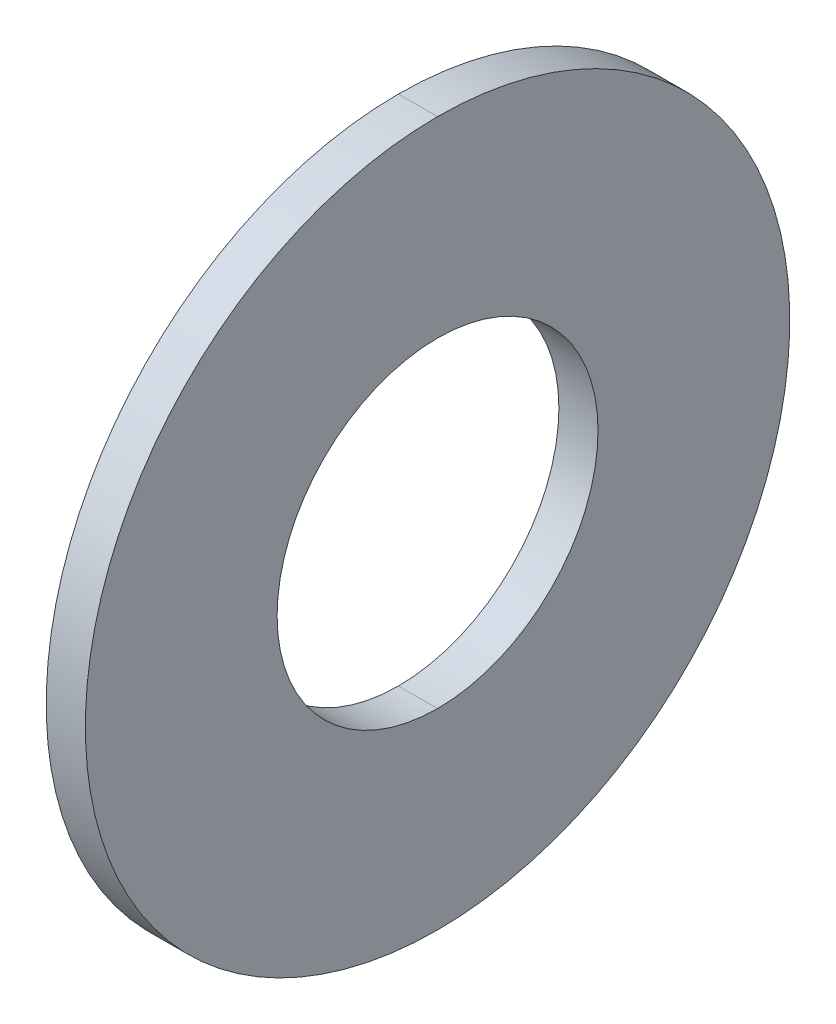
ISO-10303-21;
HEADER;
FILE_DESCRIPTION(('STEP AP214'),'2;1');
FILE_NAME('part.step','',(''),(''),'','','');
FILE_SCHEMA(('AUTOMOTIVE_DESIGN { 1 0 10303 214 1 1 1 1 }'));
ENDSEC;
DATA;
#1=APPLICATION_CONTEXT('core data for automotive mechanical design processes');
#2=APPLICATION_PROTOCOL_DEFINITION('international standard','automotive_design',2000,#1);
#3=PRODUCT_CONTEXT('',#1,'mechanical');
#4=PRODUCT('Part','Part','',(#3));
#5=PRODUCT_RELATED_PRODUCT_CATEGORY('part','',(#4));
#6=PRODUCT_DEFINITION_FORMATION('','',#4);
#7=PRODUCT_DEFINITION_CONTEXT('part definition',#1,'design');
#8=PRODUCT_DEFINITION('design','',#6,#7);
#9=PRODUCT_DEFINITION_SHAPE('','',#8);
#10=(LENGTH_UNIT() NAMED_UNIT(*) SI_UNIT(.MILLI.,.METRE.));
#11=(NAMED_UNIT(*) PLANE_ANGLE_UNIT() SI_UNIT($,.RADIAN.));
#12=(NAMED_UNIT(*) SI_UNIT($,.STERADIAN.) SOLID_ANGLE_UNIT());
#13=UNCERTAINTY_MEASURE_WITH_UNIT(LENGTH_MEASURE(1.E-05),#10,'distance_accuracy_value','');
#14=(GEOMETRIC_REPRESENTATION_CONTEXT(3) GLOBAL_UNCERTAINTY_ASSIGNED_CONTEXT((#13)) GLOBAL_UNIT_ASSIGNED_CONTEXT((#10,
#11,#12)) REPRESENTATION_CONTEXT('',''));
#15=CARTESIAN_POINT('',(0.,0.,0.));
#16=DIRECTION('',(0.,0.,1.));
#17=DIRECTION('',(1.,0.,0.));
#18=AXIS2_PLACEMENT_3D('',#15,#16,#17);
#19=CARTESIAN_POINT('',(0.,0.,0.));
#20=DIRECTION('',(1.,0.,0.));
#21=DIRECTION('',(0.,-1.,0.));
#22=AXIS2_PLACEMENT_3D('',#19,#20,#21);
#23=PLANE('',#22);
#24=CARTESIAN_POINT('',(0.,0.,0.));
#25=DIRECTION('',(1.,0.,0.));
#26=DIRECTION('',(0.,1.,0.));
#27=AXIS2_PLACEMENT_3D('',#24,#25,#26);
#28=CIRCLE('',#27,4.5);
#29=CARTESIAN_POINT('',(0.,4.5,0.));
#30=VERTEX_POINT('',#29);
#31=CARTESIAN_POINT('',(0.,-4.5,0.));
#32=VERTEX_POINT('',#31);
#33=EDGE_CURVE('E27',#30,#32,#28,.T.);
#34=ORIENTED_EDGE('',*,*,#33,.F.);
#35=CARTESIAN_POINT('',(0.,0.,0.));
#36=DIRECTION('',(1.,0.,0.));
#37=DIRECTION('',(0.,-1.,0.));
#38=AXIS2_PLACEMENT_3D('',#35,#36,#37);
#39=CIRCLE('',#38,4.5);
#40=EDGE_CURVE('E36',#32,#30,#39,.T.);
#41=ORIENTED_EDGE('',*,*,#40,.F.);
#42=EDGE_LOOP('',(#34,#41));
#43=FACE_BOUND('',#42,.T.);
#44=CARTESIAN_POINT('',(0.,0.,0.));
#45=DIRECTION('',(-1.,0.,0.));
#46=DIRECTION('',(0.,1.,0.));
#47=AXIS2_PLACEMENT_3D('',#44,#45,#46);
#48=CIRCLE('',#47,2.05);
#49=CARTESIAN_POINT('',(0.,2.05,0.));
#50=VERTEX_POINT('',#49);
#51=CARTESIAN_POINT('',(0.,-2.05,0.));
#52=VERTEX_POINT('',#51);
#53=EDGE_CURVE('E55',#50,#52,#48,.T.);
#54=ORIENTED_EDGE('',*,*,#53,.F.);
#55=CARTESIAN_POINT('',(0.,0.,0.));
#56=DIRECTION('',(-1.,0.,0.));
#57=DIRECTION('',(0.,-1.,0.));
#58=AXIS2_PLACEMENT_3D('',#55,#56,#57);
#59=CIRCLE('',#58,2.05);
#60=EDGE_CURVE('E20',#52,#50,#59,.T.);
#61=ORIENTED_EDGE('',*,*,#60,.F.);
#62=EDGE_LOOP('',(#54,#61));
#63=FACE_BOUND('',#62,.T.);
#64=ADVANCED_FACE('F16',(#43,#63),#23,.F.);
#65=CARTESIAN_POINT('',(0.,0.,0.));
#66=DIRECTION('',(-1.,0.,0.));
#67=DIRECTION('',(0.,-1.,0.));
#68=AXIS2_PLACEMENT_3D('',#65,#66,#67);
#69=CYLINDRICAL_SURFACE('',#68,4.5);
#70=DIRECTION('',(1.,0.,0.));
#71=VECTOR('',#70,1.);
#72=CARTESIAN_POINT('',(0.,-4.5,0.));
#73=LINE('',#72,#71);
#74=CARTESIAN_POINT('',(0.5,-4.5,0.));
#75=VERTEX_POINT('',#74);
#76=EDGE_CURVE('E11',#32,#75,#73,.T.);
#77=ORIENTED_EDGE('',*,*,#76,.T.);
#78=CARTESIAN_POINT('',(0.5,0.,0.));
#79=DIRECTION('',(1.,0.,0.));
#80=DIRECTION('',(0.,1.,0.));
#81=AXIS2_PLACEMENT_3D('',#78,#79,#80);
#82=CIRCLE('',#81,4.5);
#83=CARTESIAN_POINT('',(0.5,4.5,0.));
#84=VERTEX_POINT('',#83);
#85=EDGE_CURVE('E62',#84,#75,#82,.T.);
#86=ORIENTED_EDGE('',*,*,#85,.F.);
#87=DIRECTION('',(1.,0.,0.));
#88=VECTOR('',#87,1.);
#89=CARTESIAN_POINT('',(0.,4.5,0.));
#90=LINE('',#89,#88);
#91=EDGE_CURVE('E79',#30,#84,#90,.T.);
#92=ORIENTED_EDGE('',*,*,#91,.F.);
#93=ORIENTED_EDGE('',*,*,#33,.T.);
#94=EDGE_LOOP('',(#77,#86,#92,#93));
#95=FACE_BOUND('',#94,.T.);
#96=ADVANCED_FACE('F107',(#95),#69,.T.);
#97=CARTESIAN_POINT('',(0.,0.,0.));
#98=DIRECTION('',(-1.,0.,0.));
#99=DIRECTION('',(0.,-1.,0.));
#100=AXIS2_PLACEMENT_3D('',#97,#98,#99);
#101=CYLINDRICAL_SURFACE('',#100,4.5);
#102=ORIENTED_EDGE('',*,*,#91,.T.);
#103=CARTESIAN_POINT('',(0.5,0.,0.));
#104=DIRECTION('',(1.,0.,0.));
#105=DIRECTION('',(0.,-1.,0.));
#106=AXIS2_PLACEMENT_3D('',#103,#104,#105);
#107=CIRCLE('',#106,4.5);
#108=EDGE_CURVE('E83',#75,#84,#107,.T.);
#109=ORIENTED_EDGE('',*,*,#108,.F.);
#110=ORIENTED_EDGE('',*,*,#76,.F.);
#111=ORIENTED_EDGE('',*,*,#40,.T.);
#112=EDGE_LOOP('',(#102,#109,#110,#111));
#113=FACE_BOUND('',#112,.T.);
#114=ADVANCED_FACE('F108',(#113),#101,.T.);
#115=CARTESIAN_POINT('',(0.,0.,0.));
#116=DIRECTION('',(-1.,0.,0.));
#117=DIRECTION('',(0.,-1.,0.));
#118=AXIS2_PLACEMENT_3D('',#115,#116,#117);
#119=CYLINDRICAL_SURFACE('',#118,2.05);
#120=DIRECTION('',(1.,0.,0.));
#121=VECTOR('',#120,1.);
#122=CARTESIAN_POINT('',(0.,-2.05,0.));
#123=LINE('',#122,#121);
#124=CARTESIAN_POINT('',(0.5,-2.05,0.));
#125=VERTEX_POINT('',#124);
#126=EDGE_CURVE('E66',#52,#125,#123,.T.);
#127=ORIENTED_EDGE('',*,*,#126,.T.);
#128=CARTESIAN_POINT('',(0.5,0.,0.));
#129=DIRECTION('',(-1.,0.,0.));
#130=DIRECTION('',(0.,1.,0.));
#131=AXIS2_PLACEMENT_3D('',#128,#129,#130);
#132=CIRCLE('',#131,2.05);
#133=CARTESIAN_POINT('',(0.5,2.05,0.));
#134=VERTEX_POINT('',#133);
#135=EDGE_CURVE('E86',#134,#125,#132,.T.);
#136=ORIENTED_EDGE('',*,*,#135,.F.);
#137=DIRECTION('',(1.,0.,0.));
#138=VECTOR('',#137,1.);
#139=CARTESIAN_POINT('',(0.,2.05,0.));
#140=LINE('',#139,#138);
#141=EDGE_CURVE('E61',#50,#134,#140,.T.);
#142=ORIENTED_EDGE('',*,*,#141,.F.);
#143=ORIENTED_EDGE('',*,*,#53,.T.);
#144=EDGE_LOOP('',(#127,#136,#142,#143));
#145=FACE_BOUND('',#144,.T.);
#146=ADVANCED_FACE('F18',(#145),#119,.F.);
#147=CARTESIAN_POINT('',(0.,0.,0.));
#148=DIRECTION('',(-1.,0.,0.));
#149=DIRECTION('',(0.,-1.,0.));
#150=AXIS2_PLACEMENT_3D('',#147,#148,#149);
#151=CYLINDRICAL_SURFACE('',#150,2.05);
#152=ORIENTED_EDGE('',*,*,#141,.T.);
#153=CARTESIAN_POINT('',(0.5,0.,0.));
#154=DIRECTION('',(-1.,0.,0.));
#155=DIRECTION('',(0.,-1.,0.));
#156=AXIS2_PLACEMENT_3D('',#153,#154,#155);
#157=CIRCLE('',#156,2.05);
#158=EDGE_CURVE('E72',#125,#134,#157,.T.);
#159=ORIENTED_EDGE('',*,*,#158,.F.);
#160=ORIENTED_EDGE('',*,*,#126,.F.);
#161=ORIENTED_EDGE('',*,*,#60,.T.);
#162=EDGE_LOOP('',(#152,#159,#160,#161));
#163=FACE_BOUND('',#162,.T.);
#164=ADVANCED_FACE('F70',(#163),#151,.F.);
#165=CARTESIAN_POINT('',(0.5,0.,0.));
#166=DIRECTION('',(1.,0.,0.));
#167=DIRECTION('',(0.,-1.,0.));
#168=AXIS2_PLACEMENT_3D('',#165,#166,#167);
#169=PLANE('',#168);
#170=ORIENTED_EDGE('',*,*,#85,.T.);
#171=ORIENTED_EDGE('',*,*,#108,.T.);
#172=EDGE_LOOP('',(#170,#171));
#173=FACE_BOUND('',#172,.T.);
#174=ORIENTED_EDGE('',*,*,#135,.T.);
#175=ORIENTED_EDGE('',*,*,#158,.T.);
#176=EDGE_LOOP('',(#174,#175));
#177=FACE_BOUND('',#176,.T.);
#178=ADVANCED_FACE('F105',(#173,#177),#169,.T.);
#179=CLOSED_SHELL('',(#64,#96,#114,#146,#164,#178));
#180=MANIFOLD_SOLID_BREP('B1',#179);
#181=ADVANCED_BREP_SHAPE_REPRESENTATION('',(#18,#180),#14);
#182=SHAPE_DEFINITION_REPRESENTATION(#9,#181);
ENDSEC;
END-ISO-10303-21;
